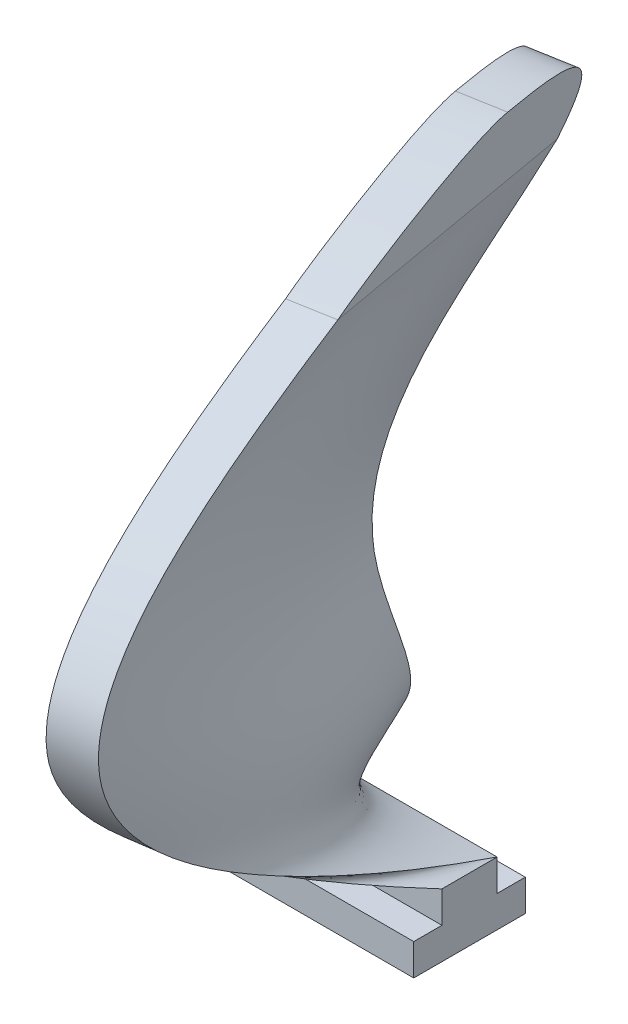
ISO-10303-21;
HEADER;
FILE_DESCRIPTION(('STEP AP214'),'2;1');
FILE_NAME('part.step','',(''),(''),'','','');
FILE_SCHEMA(('AUTOMOTIVE_DESIGN { 1 0 10303 214 1 1 1 1 }'));
ENDSEC;
DATA;
#1=APPLICATION_CONTEXT('core data for automotive mechanical design processes');
#2=APPLICATION_PROTOCOL_DEFINITION('international standard','automotive_design',2000,#1);
#3=PRODUCT_CONTEXT('',#1,'mechanical');
#4=PRODUCT('Part','Part','',(#3));
#5=PRODUCT_RELATED_PRODUCT_CATEGORY('part','',(#4));
#6=PRODUCT_DEFINITION_FORMATION('','',#4);
#7=PRODUCT_DEFINITION_CONTEXT('part definition',#1,'design');
#8=PRODUCT_DEFINITION('design','',#6,#7);
#9=PRODUCT_DEFINITION_SHAPE('','',#8);
#10=(LENGTH_UNIT() NAMED_UNIT(*) SI_UNIT(.MILLI.,.METRE.));
#11=(NAMED_UNIT(*) PLANE_ANGLE_UNIT() SI_UNIT($,.RADIAN.));
#12=(NAMED_UNIT(*) SI_UNIT($,.STERADIAN.) SOLID_ANGLE_UNIT());
#13=UNCERTAINTY_MEASURE_WITH_UNIT(LENGTH_MEASURE(1.E-05),#10,'distance_accuracy_value','');
#14=(GEOMETRIC_REPRESENTATION_CONTEXT(3) GLOBAL_UNCERTAINTY_ASSIGNED_CONTEXT((#13)) GLOBAL_UNIT_ASSIGNED_CONTEXT((#10,
#11,#12)) REPRESENTATION_CONTEXT('',''));
#15=CARTESIAN_POINT('',(0.,0.,0.));
#16=DIRECTION('',(0.,0.,1.));
#17=DIRECTION('',(1.,0.,0.));
#18=AXIS2_PLACEMENT_3D('',#15,#16,#17);
#19=CARTESIAN_POINT('',(10.,2.79856411953538,2.45));
#20=DIRECTION('',(0.,0.,-1.));
#21=DIRECTION('',(0.,1.,0.));
#22=AXIS2_PLACEMENT_3D('',#19,#20,#21);
#23=PLANE('',#22);
#24=DIRECTION('',(0.,-1.,0.));
#25=VECTOR('',#24,1.);
#26=CARTESIAN_POINT('',(-10.,2.79856411953538,2.45));
#27=LINE('',#26,#25);
#28=CARTESIAN_POINT('',(-10.,2.79856411953538,2.45));
#29=VERTEX_POINT('',#28);
#30=CARTESIAN_POINT('',(-10.,0.,2.45));
#31=VERTEX_POINT('',#30);
#32=EDGE_CURVE('E88',#29,#31,#27,.T.);
#33=ORIENTED_EDGE('',*,*,#32,.T.);
#34=DIRECTION('',(-1.,0.,0.));
#35=VECTOR('',#34,1.);
#36=CARTESIAN_POINT('',(10.,0.,2.45));
#37=LINE('',#36,#35);
#38=CARTESIAN_POINT('',(10.,0.,2.45));
#39=VERTEX_POINT('',#38);
#40=EDGE_CURVE('E12',#39,#31,#37,.T.);
#41=ORIENTED_EDGE('',*,*,#40,.F.);
#42=DIRECTION('',(0.,-1.,0.));
#43=VECTOR('',#42,1.);
#44=CARTESIAN_POINT('',(10.,2.79856411953538,2.45));
#45=LINE('',#44,#43);
#46=CARTESIAN_POINT('',(10.,2.79856411953538,2.45));
#47=VERTEX_POINT('',#46);
#48=EDGE_CURVE('E101',#47,#39,#45,.T.);
#49=ORIENTED_EDGE('',*,*,#48,.F.);
#50=DIRECTION('',(1.,0.,0.));
#51=VECTOR('',#50,1.);
#52=CARTESIAN_POINT('',(10.,2.79856411953538,2.45));
#53=LINE('',#52,#51);
#54=EDGE_CURVE('E75',#47,#29,#53,.F.);
#55=ORIENTED_EDGE('',*,*,#54,.T.);
#56=EDGE_LOOP('',(#33,#41,#49,#55));
#57=FACE_BOUND('',#56,.T.);
#58=ADVANCED_FACE('F43',(#57),#23,.F.);
#59=CARTESIAN_POINT('',(10.,2.79856411953538,-2.45));
#60=DIRECTION('',(0.,0.,1.));
#61=DIRECTION('',(0.,-1.,0.));
#62=AXIS2_PLACEMENT_3D('',#59,#60,#61);
#63=PLANE('',#62);
#64=DIRECTION('',(0.,1.,0.));
#65=VECTOR('',#64,1.);
#66=CARTESIAN_POINT('',(-10.,2.79856411953538,-2.45));
#67=LINE('',#66,#65);
#68=CARTESIAN_POINT('',(-10.,0.,-2.45));
#69=VERTEX_POINT('',#68);
#70=CARTESIAN_POINT('',(-10.,2.79856411953538,-2.45));
#71=VERTEX_POINT('',#70);
#72=EDGE_CURVE('E146',#69,#71,#67,.T.);
#73=ORIENTED_EDGE('',*,*,#72,.T.);
#74=DIRECTION('',(1.,0.,0.));
#75=VECTOR('',#74,1.);
#76=CARTESIAN_POINT('',(10.,2.79856411953538,-2.45));
#77=LINE('',#76,#75);
#78=CARTESIAN_POINT('',(10.,2.79856411953538,-2.45));
#79=VERTEX_POINT('',#78);
#80=EDGE_CURVE('E99',#79,#71,#77,.F.);
#81=ORIENTED_EDGE('',*,*,#80,.F.);
#82=DIRECTION('',(0.,1.,0.));
#83=VECTOR('',#82,1.);
#84=CARTESIAN_POINT('',(10.,2.79856411953538,-2.45));
#85=LINE('',#84,#83);
#86=CARTESIAN_POINT('',(10.,0.,-2.45));
#87=VERTEX_POINT('',#86);
#88=EDGE_CURVE('E96',#87,#79,#85,.T.);
#89=ORIENTED_EDGE('',*,*,#88,.F.);
#90=DIRECTION('',(-1.,0.,0.));
#91=VECTOR('',#90,1.);
#92=CARTESIAN_POINT('',(10.,0.,-2.45));
#93=LINE('',#92,#91);
#94=EDGE_CURVE('E53',#87,#69,#93,.T.);
#95=ORIENTED_EDGE('',*,*,#94,.T.);
#96=EDGE_LOOP('',(#73,#81,#89,#95));
#97=FACE_BOUND('',#96,.T.);
#98=ADVANCED_FACE('F97',(#97),#63,.F.);
#99=CARTESIAN_POINT('',(10.,0.,0.));
#100=DIRECTION('',(1.,0.,0.));
#101=DIRECTION('',(0.,0.,-1.));
#102=AXIS2_PLACEMENT_3D('',#99,#100,#101);
#103=PLANE('',#102);
#104=ORIENTED_EDGE('',*,*,#48,.T.);
#105=DIRECTION('',(0.,0.,1.));
#106=VECTOR('',#105,1.);
#107=CARTESIAN_POINT('',(10.,0.,4.95));
#108=LINE('',#107,#106);
#109=CARTESIAN_POINT('',(10.,0.,4.95));
#110=VERTEX_POINT('',#109);
#111=EDGE_CURVE('E119',#39,#110,#108,.T.);
#112=ORIENTED_EDGE('',*,*,#111,.T.);
#113=DIRECTION('',(0.,-1.,0.));
#114=VECTOR('',#113,1.);
#115=CARTESIAN_POINT('',(10.,0.,4.95));
#116=LINE('',#115,#114);
#117=CARTESIAN_POINT('',(10.,-2.8,4.95));
#118=VERTEX_POINT('',#117);
#119=EDGE_CURVE('E137',#110,#118,#116,.T.);
#120=ORIENTED_EDGE('',*,*,#119,.T.);
#121=DIRECTION('',(0.,0.,-1.));
#122=VECTOR('',#121,1.);
#123=CARTESIAN_POINT('',(10.,-2.8,4.95));
#124=LINE('',#123,#122);
#125=CARTESIAN_POINT('',(10.,-2.8,-4.95));
#126=VERTEX_POINT('',#125);
#127=EDGE_CURVE('E442',#118,#126,#124,.T.);
#128=ORIENTED_EDGE('',*,*,#127,.T.);
#129=DIRECTION('',(0.,1.,0.));
#130=VECTOR('',#129,1.);
#131=CARTESIAN_POINT('',(10.,0.,-4.95));
#132=LINE('',#131,#130);
#133=CARTESIAN_POINT('',(10.,0.,-4.95));
#134=VERTEX_POINT('',#133);
#135=EDGE_CURVE('E116',#126,#134,#132,.T.);
#136=ORIENTED_EDGE('',*,*,#135,.T.);
#137=EDGE_CURVE('E108',#134,#87,#108,.T.);
#138=ORIENTED_EDGE('',*,*,#137,.T.);
#139=ORIENTED_EDGE('',*,*,#88,.T.);
#140=DIRECTION('',(0.,0.,-1.));
#141=VECTOR('',#140,1.);
#142=CARTESIAN_POINT('',(10.,2.79856411953538,0.));
#143=LINE('',#142,#141);
#144=EDGE_CURVE('E62',#79,#47,#143,.F.);
#145=ORIENTED_EDGE('',*,*,#144,.T.);
#146=EDGE_LOOP('',(#104,#112,#120,#128,#136,#138,#139,#145));
#147=FACE_BOUND('',#146,.T.);
#148=ADVANCED_FACE('F113',(#147),#103,.T.);
#149=CARTESIAN_POINT('',(-10.,0.,0.));
#150=DIRECTION('',(1.,0.,0.));
#151=DIRECTION('',(0.,0.,-1.));
#152=AXIS2_PLACEMENT_3D('',#149,#150,#151);
#153=PLANE('',#152);
#154=ORIENTED_EDGE('',*,*,#32,.F.);
#155=DIRECTION('',(0.,0.,-1.));
#156=VECTOR('',#155,1.);
#157=CARTESIAN_POINT('',(-10.,2.79856411953538,0.));
#158=LINE('',#157,#156);
#159=EDGE_CURVE('E147',#71,#29,#158,.F.);
#160=ORIENTED_EDGE('',*,*,#159,.F.);
#161=ORIENTED_EDGE('',*,*,#72,.F.);
#162=DIRECTION('',(0.,0.,1.));
#163=VECTOR('',#162,1.);
#164=CARTESIAN_POINT('',(-10.,0.,4.95));
#165=LINE('',#164,#163);
#166=CARTESIAN_POINT('',(-10.,0.,-4.95));
#167=VERTEX_POINT('',#166);
#168=EDGE_CURVE('E110',#167,#69,#165,.T.);
#169=ORIENTED_EDGE('',*,*,#168,.F.);
#170=DIRECTION('',(0.,1.,0.));
#171=VECTOR('',#170,1.);
#172=CARTESIAN_POINT('',(-10.,0.,-4.95));
#173=LINE('',#172,#171);
#174=CARTESIAN_POINT('',(-10.,-2.8,-4.95));
#175=VERTEX_POINT('',#174);
#176=EDGE_CURVE('E133',#175,#167,#173,.T.);
#177=ORIENTED_EDGE('',*,*,#176,.F.);
#178=DIRECTION('',(0.,0.,-1.));
#179=VECTOR('',#178,1.);
#180=CARTESIAN_POINT('',(-10.,-2.8,4.95));
#181=LINE('',#180,#179);
#182=CARTESIAN_POINT('',(-10.,-2.8,4.95));
#183=VERTEX_POINT('',#182);
#184=EDGE_CURVE('E130',#183,#175,#181,.T.);
#185=ORIENTED_EDGE('',*,*,#184,.F.);
#186=DIRECTION('',(0.,-1.,0.));
#187=VECTOR('',#186,1.);
#188=CARTESIAN_POINT('',(-10.,0.,4.95));
#189=LINE('',#188,#187);
#190=CARTESIAN_POINT('',(-10.,0.,4.95));
#191=VERTEX_POINT('',#190);
#192=EDGE_CURVE('E127',#191,#183,#189,.T.);
#193=ORIENTED_EDGE('',*,*,#192,.F.);
#194=EDGE_CURVE('E136',#31,#191,#165,.T.);
#195=ORIENTED_EDGE('',*,*,#194,.F.);
#196=EDGE_LOOP('',(#154,#160,#161,#169,#177,#185,#193,#195));
#197=FACE_BOUND('',#196,.T.);
#198=ADVANCED_FACE('F399',(#197),#153,.F.);
#199=CARTESIAN_POINT('',(10.,0.,4.95));
#200=DIRECTION('',(0.,-1.,0.));
#201=DIRECTION('',(0.,0.,-1.));
#202=AXIS2_PLACEMENT_3D('',#199,#200,#201);
#203=PLANE('',#202);
#204=ORIENTED_EDGE('',*,*,#111,.F.);
#205=ORIENTED_EDGE('',*,*,#40,.T.);
#206=ORIENTED_EDGE('',*,*,#194,.T.);
#207=DIRECTION('',(-1.,0.,0.));
#208=VECTOR('',#207,1.);
#209=CARTESIAN_POINT('',(10.,0.,4.95));
#210=LINE('',#209,#208);
#211=EDGE_CURVE('E118',#110,#191,#210,.T.);
#212=ORIENTED_EDGE('',*,*,#211,.F.);
#213=EDGE_LOOP('',(#204,#205,#206,#212));
#214=FACE_BOUND('',#213,.T.);
#215=ADVANCED_FACE('F391',(#214),#203,.F.);
#216=CARTESIAN_POINT('',(10.,0.,4.95));
#217=DIRECTION('',(0.,0.,-1.));
#218=DIRECTION('',(0.,1.,0.));
#219=AXIS2_PLACEMENT_3D('',#216,#217,#218);
#220=PLANE('',#219);
#221=ORIENTED_EDGE('',*,*,#192,.T.);
#222=DIRECTION('',(-1.,0.,0.));
#223=VECTOR('',#222,1.);
#224=CARTESIAN_POINT('',(10.,-2.8,4.95));
#225=LINE('',#224,#223);
#226=EDGE_CURVE('E143',#118,#183,#225,.T.);
#227=ORIENTED_EDGE('',*,*,#226,.F.);
#228=ORIENTED_EDGE('',*,*,#119,.F.);
#229=ORIENTED_EDGE('',*,*,#211,.T.);
#230=EDGE_LOOP('',(#221,#227,#228,#229));
#231=FACE_BOUND('',#230,.T.);
#232=ADVANCED_FACE('F405',(#231),#220,.F.);
#233=CARTESIAN_POINT('',(10.,-2.8,4.95));
#234=DIRECTION('',(0.,1.,0.));
#235=DIRECTION('',(0.,0.,1.));
#236=AXIS2_PLACEMENT_3D('',#233,#234,#235);
#237=PLANE('',#236);
#238=ORIENTED_EDGE('',*,*,#184,.T.);
#239=DIRECTION('',(-1.,0.,0.));
#240=VECTOR('',#239,1.);
#241=CARTESIAN_POINT('',(10.,-2.8,-4.95));
#242=LINE('',#241,#240);
#243=EDGE_CURVE('E140',#126,#175,#242,.T.);
#244=ORIENTED_EDGE('',*,*,#243,.F.);
#245=ORIENTED_EDGE('',*,*,#127,.F.);
#246=ORIENTED_EDGE('',*,*,#226,.T.);
#247=EDGE_LOOP('',(#238,#244,#245,#246));
#248=FACE_BOUND('',#247,.T.);
#249=ADVANCED_FACE('F408',(#248),#237,.F.);
#250=CARTESIAN_POINT('',(10.,0.,-4.95));
#251=DIRECTION('',(0.,0.,1.));
#252=DIRECTION('',(0.,-1.,0.));
#253=AXIS2_PLACEMENT_3D('',#250,#251,#252);
#254=PLANE('',#253);
#255=ORIENTED_EDGE('',*,*,#176,.T.);
#256=DIRECTION('',(-1.,0.,0.));
#257=VECTOR('',#256,1.);
#258=CARTESIAN_POINT('',(10.,0.,-4.95));
#259=LINE('',#258,#257);
#260=EDGE_CURVE('E122',#134,#167,#259,.T.);
#261=ORIENTED_EDGE('',*,*,#260,.F.);
#262=ORIENTED_EDGE('',*,*,#135,.F.);
#263=ORIENTED_EDGE('',*,*,#243,.T.);
#264=EDGE_LOOP('',(#255,#261,#262,#263));
#265=FACE_BOUND('',#264,.T.);
#266=ADVANCED_FACE('F390',(#265),#254,.F.);
#267=ORIENTED_EDGE('',*,*,#94,.F.);
#268=ORIENTED_EDGE('',*,*,#137,.F.);
#269=ORIENTED_EDGE('',*,*,#260,.T.);
#270=ORIENTED_EDGE('',*,*,#168,.T.);
#271=EDGE_LOOP('',(#267,#268,#269,#270));
#272=FACE_BOUND('',#271,.T.);
#273=ADVANCED_FACE('F106',(#272),#203,.F.);
#274=CARTESIAN_POINT('',(10.,2.79856411953538,-2.45));
#275=CARTESIAN_POINT('',(7.82884164371637,4.1239699270205,5.6409345672917));
#276=CARTESIAN_POINT('',(4.15156271635673,8.44077638467502,19.5439806027954));
#277=CARTESIAN_POINT('',(5.33590133816238,27.3227179117272,34.6878484329079));
#278=CARTESIAN_POINT('',(2.73807113629218,37.2052366361012,14.7643076723296));
#279=CARTESIAN_POINT('',(1.65339363802755,42.7985641195354,3.34252087917122));
#280=CARTESIAN_POINT('',(3.33333333333333,2.79856411953538,-2.45));
#281=CARTESIAN_POINT('',(3.66063205225054,4.27186432247661,2.58406787890734));
#282=CARTESIAN_POINT('',(6.13330594140587,8.38421205479549,10.7984614683579));
#283=CARTESIAN_POINT('',(4.33712415093049,27.3995204505144,23.3558761825323));
#284=CARTESIAN_POINT('',(1.14564073566331,36.9323309027788,5.71194109153355));
#285=CARTESIAN_POINT('',(0.264208216692133,42.7985641195354,-4.53594114492645));
#286=CARTESIAN_POINT('',(-3.33333333333333,2.79856411953538,-2.45));
#287=CARTESIAN_POINT('',(-0.507577539215303,4.41975871793272,-0.472798809477014));
#288=CARTESIAN_POINT('',(5.7833872140185,8.32764772491597,2.46407724602638));
#289=CARTESIAN_POINT('',(1.6008898778569,27.4763229893015,12.3302644942138));
#290=CARTESIAN_POINT('',(-0.446789664965559,36.6594251694563,-3.34042548926246));
#291=CARTESIAN_POINT('',(-1.12497720464329,42.7985641195354,-12.4144031690241));
#292=CARTESIAN_POINT('',(-10.,2.79856411953538,-2.45));
#293=CARTESIAN_POINT('',(-4.67578713068114,4.56765311338883,-3.52966549786137));
#294=CARTESIAN_POINT('',(3.10180653419464,8.27108339503645,-5.45917206419919));
#295=CARTESIAN_POINT('',(-2.87280148105839,27.5531255280886,1.61101336795227));
#296=CARTESIAN_POINT('',(-2.03922006559443,36.3865194361338,-12.3927920700585));
#297=CARTESIAN_POINT('',(-2.51416262597871,42.7985641195354,-20.2928651931218));
#298=B_SPLINE_SURFACE_WITH_KNOTS('',3,3,((#274,#275,#276,#277,#278,#279),(#280,#281,#282,#283,
#284,#285),(#286,#287,#288,#289,#290,#291),(#292,#293,#294,#295,#296,#297)),.UNSPECIFIED.,.F.,
.F.,.F.,(4,4),(4,1,1,4),(0.,1.),(0.,0.278483635602141,0.473734775211287,1.),.UNSPECIFIED.);
#299=CARTESIAN_POINT('',(-10.,2.79856411953538,-2.45));
#300=CARTESIAN_POINT('',(-4.67578713068114,4.56765311338883,-3.52966549786137));
#301=CARTESIAN_POINT('',(3.10180653419464,8.27108339503645,-5.45917206419919));
#302=CARTESIAN_POINT('',(-2.87280148105839,27.5531255280886,1.61101336795227));
#303=CARTESIAN_POINT('',(-2.03922006559443,36.3865194361338,-12.3927920700585));
#304=CARTESIAN_POINT('',(-2.51416262597871,42.7985641195354,-20.2928651931218));
#305=B_SPLINE_CURVE_WITH_KNOTS('',3,(#299,#300,#301,#302,#303,#304),.UNSPECIFIED.,.F.,.F.,(4,1,
1,4),(0.,0.278483635602141,0.473734775211287,1.),.UNSPECIFIED.);
#306=CARTESIAN_POINT('',(-2.51416262597871,42.7985641195354,-20.2928651931218));
#307=VERTEX_POINT('',#306);
#308=EDGE_CURVE('E268',#71,#307,#305,.T.);
#309=DIRECTION('',(-0.173648177666928,0.,-0.984807753012209));
#310=VECTOR('',#309,1.);
#311=CARTESIAN_POINT('',(-2.51416262597871,42.7985641195354,-20.2928651931218));
#312=LINE('',#311,#310);
#313=CARTESIAN_POINT('',(1.65339363802755,42.7985641195354,3.34252087917122));
#314=VERTEX_POINT('',#313);
#315=EDGE_CURVE('E216',#314,#307,#312,.T.);
#316=CARTESIAN_POINT('',(10.,2.79856411953538,-2.45));
#317=CARTESIAN_POINT('',(7.82884164371637,4.1239699270205,5.6409345672917));
#318=CARTESIAN_POINT('',(4.15156271635673,8.44077638467502,19.5439806027954));
#319=CARTESIAN_POINT('',(5.33590133816238,27.3227179117272,34.6878484329079));
#320=CARTESIAN_POINT('',(2.73807113629218,37.2052366361012,14.7643076723296));
#321=CARTESIAN_POINT('',(1.65339363802755,42.7985641195354,3.34252087917122));
#322=B_SPLINE_CURVE_WITH_KNOTS('',3,(#316,#317,#318,#319,#320,#321),.UNSPECIFIED.,.F.,.F.,(4,1,
1,4),(0.,0.278483635602141,0.473734775211287,1.),.UNSPECIFIED.);
#323=EDGE_CURVE('E267',#314,#79,#322,.F.);
#324=ORIENTED_EDGE('',*,*,#80,.T.);
#325=ORIENTED_EDGE('',*,*,#308,.T.);
#326=ORIENTED_EDGE('',*,*,#315,.F.);
#327=ORIENTED_EDGE('',*,*,#323,.T.);
#328=EDGE_LOOP('',(#324,#325,#326,#327));
#329=FACE_BOUND('',#328,.T.);
#330=ADVANCED_FACE('F371',(#329),#298,.T.);
#331=CARTESIAN_POINT('',(-10.,2.79856411953538,-2.45));
#332=CARTESIAN_POINT('',(-4.67578713068114,4.56765311338883,-3.52966549786137));
#333=CARTESIAN_POINT('',(3.10180653419464,8.27108339503645,-5.45917206419919));
#334=CARTESIAN_POINT('',(-2.87280148105839,27.5531255280886,1.61101336795226));
#335=CARTESIAN_POINT('',(-2.03922006559443,36.3865194361338,-12.3927920700585));
#336=CARTESIAN_POINT('',(-2.51416262597871,42.7985641195354,-20.2928651931218));
#337=CARTESIAN_POINT('',(-10.,2.79856411953538,-0.816666666666666));
#338=CARTESIAN_POINT('',(-5.26554212451829,4.65086780414338,-2.57124619651446));
#339=CARTESIAN_POINT('',(1.56560478010021,8.24541397420293,-5.45186604224429));
#340=CARTESIAN_POINT('',(-4.02812571826075,27.5712742191575,2.00107484890353));
#341=CARTESIAN_POINT('',(-3.35229706961071,36.3865194361338,-12.1612611665026));
#342=CARTESIAN_POINT('',(-3.82723962999499,42.7985641195354,-20.0613342895659));
#343=CARTESIAN_POINT('',(-10.,2.79856411953538,0.816666666666667));
#344=CARTESIAN_POINT('',(-5.85529711835543,4.73408249489792,-1.61282689516755));
#345=CARTESIAN_POINT('',(0.0294030260057778,8.21974455336941,-5.44456002028939));
#346=CARTESIAN_POINT('',(-5.18344995546311,27.5894229102264,2.3911363298548));
#347=CARTESIAN_POINT('',(-4.66537407362698,36.3865194361338,-11.9297302629467));
#348=CARTESIAN_POINT('',(-5.14031663401126,42.7985641195354,-19.82980338601));
#349=CARTESIAN_POINT('',(-10.,2.79856411953538,2.45));
#350=CARTESIAN_POINT('',(-6.44505211219257,4.81729718565246,-0.654407593820641));
#351=CARTESIAN_POINT('',(-1.50679872808865,8.19407513253588,-5.4372539983345));
#352=CARTESIAN_POINT('',(-6.33877419266547,27.6075716012953,2.78119781080607));
#353=CARTESIAN_POINT('',(-5.97845107764326,36.3865194361338,-11.6981993593908));
#354=CARTESIAN_POINT('',(-6.45339363802754,42.7985641195354,-19.5982724824541));
#355=B_SPLINE_SURFACE_WITH_KNOTS('',3,3,((#331,#332,#333,#334,#335,#336),(#337,#338,#339,#340,
#341,#342),(#343,#344,#345,#346,#347,#348),(#349,#350,#351,#352,#353,#354)),.UNSPECIFIED.,.F.,
.F.,.F.,(4,4),(4,1,1,4),(0.,1.),(0.,0.278483635602141,0.473734775211287,1.),.UNSPECIFIED.);
#356=CARTESIAN_POINT('',(-10.,2.79856411953538,2.45));
#357=CARTESIAN_POINT('',(-6.44505211219257,4.81729718565246,-0.654407593820641));
#358=CARTESIAN_POINT('',(-1.50679872808865,8.19407513253588,-5.4372539983345));
#359=CARTESIAN_POINT('',(-6.33877419266547,27.6075716012953,2.78119781080607));
#360=CARTESIAN_POINT('',(-5.97845107764326,36.3865194361338,-11.6981993593908));
#361=CARTESIAN_POINT('',(-6.45339363802754,42.7985641195354,-19.5982724824541));
#362=B_SPLINE_CURVE_WITH_KNOTS('',3,(#356,#357,#358,#359,#360,#361),.UNSPECIFIED.,.F.,.F.,(4,1,
1,4),(0.,0.278483635602141,0.473734775211287,1.),.UNSPECIFIED.);
#363=CARTESIAN_POINT('',(-6.45339363802754,42.7985641195354,-19.5982724824541));
#364=VERTEX_POINT('',#363);
#365=EDGE_CURVE('E269',#29,#364,#362,.T.);
#366=DIRECTION('',(-0.984807753012209,0.,0.173648177666927));
#367=VECTOR('',#366,1.);
#368=CARTESIAN_POINT('',(-6.45339363802754,42.7985641195354,-19.5982724824541));
#369=LINE('',#368,#367);
#370=EDGE_CURVE('E220',#307,#364,#369,.T.);
#371=ORIENTED_EDGE('',*,*,#159,.T.);
#372=ORIENTED_EDGE('',*,*,#365,.T.);
#373=ORIENTED_EDGE('',*,*,#370,.F.);
#374=ORIENTED_EDGE('',*,*,#308,.F.);
#375=EDGE_LOOP('',(#371,#372,#373,#374));
#376=FACE_BOUND('',#375,.T.);
#377=ADVANCED_FACE('F325',(#376),#355,.T.);
#378=CARTESIAN_POINT('',(10.,2.79856411953538,2.45));
#379=CARTESIAN_POINT('',(6.00193501471665,4.2755348158669,8.88978455179783));
#380=CARTESIAN_POINT('',(-0.439261698656704,8.39402282613737,19.4506558882497));
#381=CARTESIAN_POINT('',(1.85735728316049,27.3557734253586,35.939511364628));
#382=CARTESIAN_POINT('',(-1.20115987575665,37.2052366361012,15.4589003829973));
#383=CARTESIAN_POINT('',(-2.28583737402128,42.7985641195354,4.03711358983893));
#384=CARTESIAN_POINT('',(10.,2.79856411953538,0.816666666666667));
#385=CARTESIAN_POINT('',(6.61090389104989,4.22501318625144,7.80683455696245));
#386=CARTESIAN_POINT('',(1.09101310634777,8.40960734564992,19.4817641264316));
#387=CARTESIAN_POINT('',(3.01687196816112,27.3447549208148,35.522290387388));
#388=CARTESIAN_POINT('',(0.111917128259624,37.2052366361012,15.2273694794414));
#389=CARTESIAN_POINT('',(-0.972760370005002,42.7985641195354,3.80558268628303));
#390=CARTESIAN_POINT('',(10.,2.79856411953538,-0.816666666666666));
#391=CARTESIAN_POINT('',(7.21987276738313,4.17449155663597,6.72388456212708));
#392=CARTESIAN_POINT('',(2.62128791135225,8.42519186516247,19.5128723646135));
#393=CARTESIAN_POINT('',(4.17638665316175,27.333736416271,35.1050694101479));
#394=CARTESIAN_POINT('',(1.4249941322759,37.2052366361012,14.9958385758855));
#395=CARTESIAN_POINT('',(0.340316634011276,42.7985641195354,3.57405178272712));
#396=CARTESIAN_POINT('',(10.,2.79856411953538,-2.45));
#397=CARTESIAN_POINT('',(7.82884164371637,4.1239699270205,5.6409345672917));
#398=CARTESIAN_POINT('',(4.15156271635673,8.44077638467502,19.5439806027954));
#399=CARTESIAN_POINT('',(5.33590133816238,27.3227179117272,34.6878484329079));
#400=CARTESIAN_POINT('',(2.73807113629218,37.2052366361012,14.7643076723296));
#401=CARTESIAN_POINT('',(1.65339363802755,42.7985641195354,3.34252087917122));
#402=B_SPLINE_SURFACE_WITH_KNOTS('',3,3,((#378,#379,#380,#381,#382,#383),(#384,#385,#386,#387,
#388,#389),(#390,#391,#392,#393,#394,#395),(#396,#397,#398,#399,#400,#401)),.UNSPECIFIED.,.F.,
.F.,.F.,(4,4),(4,1,1,4),(0.,1.),(0.,0.278483635602141,0.473734775211287,1.),.UNSPECIFIED.);
#403=DIRECTION('',(0.984807753012208,0.,-0.173648177666928));
#404=VECTOR('',#403,1.);
#405=CARTESIAN_POINT('',(1.65339363802755,42.7985641195354,3.34252087917122));
#406=LINE('',#405,#404);
#407=CARTESIAN_POINT('',(-2.28583737402128,42.7985641195354,4.03711358983893));
#408=VERTEX_POINT('',#407);
#409=EDGE_CURVE('E46',#408,#314,#406,.T.);
#410=CARTESIAN_POINT('',(10.,2.79856411953538,2.45));
#411=CARTESIAN_POINT('',(6.00193501471665,4.2755348158669,8.88978455179783));
#412=CARTESIAN_POINT('',(-0.439261698656704,8.39402282613737,19.4506558882497));
#413=CARTESIAN_POINT('',(1.85735728316049,27.3557734253586,35.9395113646281));
#414=CARTESIAN_POINT('',(-1.20115987575665,37.2052366361012,15.4589003829973));
#415=CARTESIAN_POINT('',(-2.28583737402128,42.7985641195354,4.03711358983893));
#416=B_SPLINE_CURVE_WITH_KNOTS('',3,(#410,#411,#412,#413,#414,#415),.UNSPECIFIED.,.F.,.F.,(4,1,
1,4),(0.,0.278483635602141,0.473734775211287,1.),.UNSPECIFIED.);
#417=EDGE_CURVE('E288',#47,#408,#416,.T.);
#418=ORIENTED_EDGE('',*,*,#144,.F.);
#419=ORIENTED_EDGE('',*,*,#323,.F.);
#420=ORIENTED_EDGE('',*,*,#409,.F.);
#421=ORIENTED_EDGE('',*,*,#417,.F.);
#422=EDGE_LOOP('',(#418,#419,#420,#421));
#423=FACE_BOUND('',#422,.T.);
#424=ADVANCED_FACE('F312',(#423),#402,.T.);
#425=CARTESIAN_POINT('',(-10.,2.79856411953538,2.45));
#426=CARTESIAN_POINT('',(-6.44505211219257,4.81729718565246,-0.654407593820641));
#427=CARTESIAN_POINT('',(-1.50679872808865,8.19407513253588,-5.4372539983345));
#428=CARTESIAN_POINT('',(-6.33877419266547,27.6075716012953,2.78119781080607));
#429=CARTESIAN_POINT('',(-5.97845107764326,36.3865194361338,-11.6981993593907));
#430=CARTESIAN_POINT('',(-6.45339363802754,42.7985641195354,-19.5982724824541));
#431=CARTESIAN_POINT('',(-3.33333333333333,2.79856411953538,2.45));
#432=CARTESIAN_POINT('',(-2.29605640322283,4.63670972905727,2.52698978805218));
#433=CARTESIAN_POINT('',(0.181425206923805,8.26072436373638,2.62378172837113));
#434=CARTESIAN_POINT('',(-2.61389774690917,27.5236388759831,13.6589058170951));
#435=CARTESIAN_POINT('',(-4.38602067701439,36.6594251694563,-2.64583277859474));
#436=CARTESIAN_POINT('',(-5.06420821669212,42.7985641195354,-11.7198104583564));
#437=CARTESIAN_POINT('',(3.33333333333333,2.79856411953538,2.45));
#438=CARTESIAN_POINT('',(1.85293930574691,4.45612227246209,5.70838716992501));
#439=CARTESIAN_POINT('',(0.537270883401121,8.32737359493687,10.9197516905659));
#440=CARTESIAN_POINT('',(0.118146078366145,27.4397061506709,24.7116770017024));
#441=CARTESIAN_POINT('',(-2.79359027638552,36.9323309027788,6.40653380220127));
#442=CARTESIAN_POINT('',(-3.6750227953567,42.7985641195354,-3.84134843425874));
#443=CARTESIAN_POINT('',(10.,2.79856411953538,2.45));
#444=CARTESIAN_POINT('',(6.00193501471665,4.2755348158669,8.88978455179783));
#445=CARTESIAN_POINT('',(-0.439261698656704,8.39402282613737,19.4506558882497));
#446=CARTESIAN_POINT('',(1.85735728316049,27.3557734253586,35.9395113646281));
#447=CARTESIAN_POINT('',(-1.20115987575665,37.2052366361012,15.4589003829973));
#448=CARTESIAN_POINT('',(-2.28583737402128,42.7985641195354,4.03711358983893));
#449=B_SPLINE_SURFACE_WITH_KNOTS('',3,3,((#425,#426,#427,#428,#429,#430),(#431,#432,#433,#434,
#435,#436),(#437,#438,#439,#440,#441,#442),(#443,#444,#445,#446,#447,#448)),.UNSPECIFIED.,.F.,
.F.,.F.,(4,4),(4,1,1,4),(0.,1.),(0.,0.278483635602141,0.473734775211287,1.),.UNSPECIFIED.);
#450=DIRECTION('',(0.173648177666928,0.,0.984807753012208));
#451=VECTOR('',#450,1.);
#452=CARTESIAN_POINT('',(-2.28583737402128,42.7985641195354,4.03711358983893));
#453=LINE('',#452,#451);
#454=EDGE_CURVE('E234',#364,#408,#453,.T.);
#455=ORIENTED_EDGE('',*,*,#54,.F.);
#456=ORIENTED_EDGE('',*,*,#417,.T.);
#457=ORIENTED_EDGE('',*,*,#454,.F.);
#458=ORIENTED_EDGE('',*,*,#365,.F.);
#459=EDGE_LOOP('',(#455,#456,#457,#458));
#460=FACE_BOUND('',#459,.T.);
#461=ADVANCED_FACE('F324',(#460),#449,.T.);
#462=CARTESIAN_POINT('',(-5.51202069266612,48.,-14.2594812119458));
#463=CARTESIAN_POINT('',(-6.82152230094564,48.,-21.6860338757417));
#464=CARTESIAN_POINT('',(-7.39867744120228,47.2379860459002,-24.9592433297781));
#465=CARTESIAN_POINT('',(-6.45339363802755,42.7985641195354,-19.5982724824541));
#466=B_SPLINE_CURVE_WITH_KNOTS('',3,(#462,#463,#464,#465),.UNSPECIFIED.,.F.,.F.,(4,4),(0.,1.),.UNSPECIFIED.);
#467=DIRECTION('',(0.984807753012208,0.,-0.173648177666928));
#468=VECTOR('',#467,1.);
#469=SURFACE_OF_LINEAR_EXTRUSION('',#466,#468);
#470=CARTESIAN_POINT('',(-1.57278968061728,48.,-14.9540739226135));
#471=CARTESIAN_POINT('',(-2.8822912888968,48.,-22.3806265864094));
#472=CARTESIAN_POINT('',(-3.45944642915344,47.2379860459002,-25.6538360404458));
#473=CARTESIAN_POINT('',(-2.51416262597871,42.7985641195354,-20.2928651931218));
#474=B_SPLINE_CURVE_WITH_KNOTS('',3,(#470,#471,#472,#473),.UNSPECIFIED.,.F.,.F.,(4,4),(0.,1.),.UNSPECIFIED.);
#475=CARTESIAN_POINT('',(-1.57278968061728,48.,-14.9540739226135));
#476=VERTEX_POINT('',#475);
#477=EDGE_CURVE('E215',#476,#307,#474,.T.);
#478=ORIENTED_EDGE('',*,*,#477,.T.);
#479=ORIENTED_EDGE('',*,*,#370,.T.);
#480=CARTESIAN_POINT('',(-5.51202069266612,48.,-14.2594812119458));
#481=VERTEX_POINT('',#480);
#482=EDGE_CURVE('E161',#481,#364,#466,.T.);
#483=ORIENTED_EDGE('',*,*,#482,.F.);
#484=DIRECTION('',(0.984807753012208,0.,-0.173648177666928));
#485=VECTOR('',#484,1.);
#486=CARTESIAN_POINT('',(-5.51202069266612,48.,-14.2594812119458));
#487=LINE('',#486,#485);
#488=EDGE_CURVE('E160',#481,#476,#487,.T.);
#489=ORIENTED_EDGE('',*,*,#488,.T.);
#490=EDGE_LOOP('',(#478,#479,#483,#489));
#491=FACE_BOUND('',#490,.T.);
#492=ADVANCED_FACE('F184',(#491),#469,.F.);
#493=CARTESIAN_POINT('',(-2.28583737402128,42.7985641195354,4.03711358983894));
#494=CARTESIAN_POINT('',(-2.61413316675067,43.7231936888383,2.17525562907572));
#495=CARTESIAN_POINT('',(-4.7052463426445,48.,-9.68403650813422));
#496=CARTESIAN_POINT('',(-5.51202069266612,48.,-14.2594812119458));
#497=B_SPLINE_CURVE_WITH_KNOTS('',3,(#493,#494,#495,#496),.UNSPECIFIED.,.F.,.F.,(4,4),(0.,1.),.UNSPECIFIED.);
#498=DIRECTION('',(0.984807753012208,0.,-0.173648177666928));
#499=VECTOR('',#498,1.);
#500=SURFACE_OF_LINEAR_EXTRUSION('',#497,#499);
#501=CARTESIAN_POINT('',(1.65339363802755,42.7985641195354,3.34252087917122));
#502=CARTESIAN_POINT('',(1.32509784529816,43.7231936888383,1.48066291840801));
#503=CARTESIAN_POINT('',(-0.766015330595665,48.,-10.3786292188019));
#504=CARTESIAN_POINT('',(-1.57278968061728,48.,-14.9540739226135));
#505=B_SPLINE_CURVE_WITH_KNOTS('',3,(#501,#502,#503,#504),.UNSPECIFIED.,.F.,.F.,(4,4),(0.,1.),.UNSPECIFIED.);
#506=EDGE_CURVE('E210',#314,#476,#505,.T.);
#507=ORIENTED_EDGE('',*,*,#506,.T.);
#508=ORIENTED_EDGE('',*,*,#488,.F.);
#509=EDGE_CURVE('E156',#408,#481,#497,.T.);
#510=ORIENTED_EDGE('',*,*,#509,.F.);
#511=ORIENTED_EDGE('',*,*,#409,.T.);
#512=EDGE_LOOP('',(#507,#508,#510,#511));
#513=FACE_BOUND('',#512,.T.);
#514=ADVANCED_FACE('F178',(#513),#500,.F.);
#515=CARTESIAN_POINT('',(-6.82825169464218,47.0640652821545,-21.7241981638699));
#516=DIRECTION('',(-0.984807753012208,0.,0.173648177666928));
#517=DIRECTION('',(0.173648177666928,0.,0.984807753012209));
#518=AXIS2_PLACEMENT_3D('',#515,#516,#517);
#519=PLANE('',#518);
#520=ORIENTED_EDGE('',*,*,#482,.T.);
#521=ORIENTED_EDGE('',*,*,#454,.T.);
#522=ORIENTED_EDGE('',*,*,#509,.T.);
#523=EDGE_LOOP('',(#520,#521,#522));
#524=FACE_BOUND('',#523,.T.);
#525=ADVANCED_FACE('F183',(#524),#519,.T.);
#526=CARTESIAN_POINT('',(-2.88902068259334,47.0640652821545,-22.4187908745376));
#527=DIRECTION('',(-0.984807753012208,0.,0.173648177666928));
#528=DIRECTION('',(0.173648177666928,0.,0.984807753012209));
#529=AXIS2_PLACEMENT_3D('',#526,#527,#528);
#530=PLANE('',#529);
#531=ORIENTED_EDGE('',*,*,#477,.F.);
#532=ORIENTED_EDGE('',*,*,#506,.F.);
#533=ORIENTED_EDGE('',*,*,#315,.T.);
#534=EDGE_LOOP('',(#531,#532,#533));
#535=FACE_BOUND('',#534,.T.);
#536=ADVANCED_FACE('F186',(#535),#530,.F.);
#537=CLOSED_SHELL('',(#58,#98,#148,#198,#215,#232,#249,#266,#273,#330,#377,#424,#461,#492,#514,
#525,#536));
#538=MANIFOLD_SOLID_BREP('B2',#537);
#539=ADVANCED_BREP_SHAPE_REPRESENTATION('',(#18,#538),#14);
#540=SHAPE_DEFINITION_REPRESENTATION(#9,#539);
ENDSEC;
END-ISO-10303-21;
